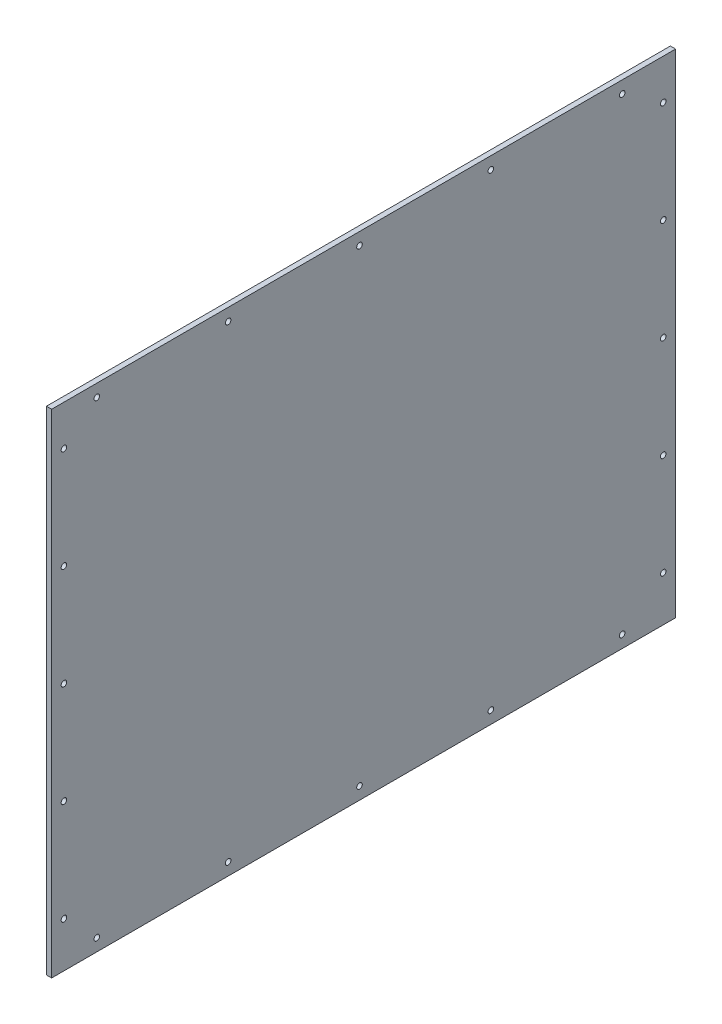
ISO-10303-21;
HEADER;
FILE_DESCRIPTION(('STEP AP214'),'2;1');
FILE_NAME('part.step','',(''),(''),'','','');
FILE_SCHEMA(('AUTOMOTIVE_DESIGN { 1 0 10303 214 1 1 1 1 }'));
ENDSEC;
DATA;
#1=APPLICATION_CONTEXT('core data for automotive mechanical design processes');
#2=APPLICATION_PROTOCOL_DEFINITION('international standard','automotive_design',2000,#1);
#3=PRODUCT_CONTEXT('',#1,'mechanical');
#4=PRODUCT('Part','Part','',(#3));
#5=PRODUCT_RELATED_PRODUCT_CATEGORY('part','',(#4));
#6=PRODUCT_DEFINITION_FORMATION('','',#4);
#7=PRODUCT_DEFINITION_CONTEXT('part definition',#1,'design');
#8=PRODUCT_DEFINITION('design','',#6,#7);
#9=PRODUCT_DEFINITION_SHAPE('','',#8);
#10=(LENGTH_UNIT() NAMED_UNIT(*) SI_UNIT(.MILLI.,.METRE.));
#11=(NAMED_UNIT(*) PLANE_ANGLE_UNIT() SI_UNIT($,.RADIAN.));
#12=(NAMED_UNIT(*) SI_UNIT($,.STERADIAN.) SOLID_ANGLE_UNIT());
#13=UNCERTAINTY_MEASURE_WITH_UNIT(LENGTH_MEASURE(1.E-05),#10,'distance_accuracy_value','');
#14=(GEOMETRIC_REPRESENTATION_CONTEXT(3) GLOBAL_UNCERTAINTY_ASSIGNED_CONTEXT((#13)) GLOBAL_UNIT_ASSIGNED_CONTEXT((#10,
#11,#12)) REPRESENTATION_CONTEXT('',''));
#15=CARTESIAN_POINT('',(0.,0.,0.));
#16=DIRECTION('',(0.,0.,1.));
#17=DIRECTION('',(1.,0.,0.));
#18=AXIS2_PLACEMENT_3D('',#15,#16,#17);
#19=CARTESIAN_POINT('',(247.868827342018,163.360031126517,423.699106878546));
#20=DIRECTION('',(0.,0.,-1.));
#21=DIRECTION('',(0.,1.,0.));
#22=AXIS2_PLACEMENT_3D('',#19,#20,#21);
#23=PLANE('',#22);
#24=DIRECTION('',(0.,-1.,0.));
#25=VECTOR('',#24,1.);
#26=CARTESIAN_POINT('',(244.693827342018,163.360031126517,423.699106878546));
#27=LINE('',#26,#25);
#28=CARTESIAN_POINT('',(244.693827342018,163.360031126517,423.699106878546));
#29=VERTEX_POINT('',#28);
#30=CARTESIAN_POINT('',(244.693827342018,-136.639968873483,423.699106878546));
#31=VERTEX_POINT('',#30);
#32=EDGE_CURVE('E96',#29,#31,#27,.T.);
#33=ORIENTED_EDGE('',*,*,#32,.T.);
#34=DIRECTION('',(-1.,0.,0.));
#35=VECTOR('',#34,1.);
#36=CARTESIAN_POINT('',(247.868827342018,-136.639968873483,423.699106878546));
#37=LINE('',#36,#35);
#38=CARTESIAN_POINT('',(247.868827342018,-136.639968873483,423.699106878546));
#39=VERTEX_POINT('',#38);
#40=EDGE_CURVE('E11',#39,#31,#37,.T.);
#41=ORIENTED_EDGE('',*,*,#40,.F.);
#42=DIRECTION('',(0.,-1.,0.));
#43=VECTOR('',#42,1.);
#44=CARTESIAN_POINT('',(247.868827342018,163.360031126517,423.699106878546));
#45=LINE('',#44,#43);
#46=CARTESIAN_POINT('',(247.868827342018,163.360031126517,423.699106878546));
#47=VERTEX_POINT('',#46);
#48=EDGE_CURVE('E84',#47,#39,#45,.T.);
#49=ORIENTED_EDGE('',*,*,#48,.F.);
#50=DIRECTION('',(-1.,0.,0.));
#51=VECTOR('',#50,1.);
#52=CARTESIAN_POINT('',(247.868827342018,163.360031126517,423.699106878546));
#53=LINE('',#52,#51);
#54=EDGE_CURVE('E92',#47,#29,#53,.T.);
#55=ORIENTED_EDGE('',*,*,#54,.T.);
#56=EDGE_LOOP('',(#33,#41,#49,#55));
#57=FACE_BOUND('',#56,.T.);
#58=ADVANCED_FACE('F33',(#57),#23,.F.);
#59=CARTESIAN_POINT('',(247.868827342018,-136.639968873483,423.699106878546));
#60=DIRECTION('',(0.,1.,0.));
#61=DIRECTION('',(0.,0.,1.));
#62=AXIS2_PLACEMENT_3D('',#59,#60,#61);
#63=PLANE('',#62);
#64=DIRECTION('',(0.,0.,-1.));
#65=VECTOR('',#64,1.);
#66=CARTESIAN_POINT('',(244.693827342018,-136.639968873483,423.699106878546));
#67=LINE('',#66,#65);
#68=CARTESIAN_POINT('',(244.693827342018,-136.639968873483,43.699106878546));
#69=VERTEX_POINT('',#68);
#70=EDGE_CURVE('E88',#31,#69,#67,.T.);
#71=ORIENTED_EDGE('',*,*,#70,.T.);
#72=DIRECTION('',(-1.,0.,0.));
#73=VECTOR('',#72,1.);
#74=CARTESIAN_POINT('',(247.868827342018,-136.639968873483,43.699106878546));
#75=LINE('',#74,#73);
#76=CARTESIAN_POINT('',(247.868827342018,-136.639968873483,43.699106878546));
#77=VERTEX_POINT('',#76);
#78=EDGE_CURVE('E41',#77,#69,#75,.T.);
#79=ORIENTED_EDGE('',*,*,#78,.F.);
#80=DIRECTION('',(0.,0.,-1.));
#81=VECTOR('',#80,1.);
#82=CARTESIAN_POINT('',(247.868827342018,-136.639968873483,423.699106878546));
#83=LINE('',#82,#81);
#84=EDGE_CURVE('E79',#39,#77,#83,.T.);
#85=ORIENTED_EDGE('',*,*,#84,.F.);
#86=ORIENTED_EDGE('',*,*,#40,.T.);
#87=EDGE_LOOP('',(#71,#79,#85,#86));
#88=FACE_BOUND('',#87,.T.);
#89=ADVANCED_FACE('F87',(#88),#63,.F.);
#90=CARTESIAN_POINT('',(247.868827342018,163.360031126517,43.6991068785461));
#91=DIRECTION('',(0.,0.,1.));
#92=DIRECTION('',(0.,-1.,0.));
#93=AXIS2_PLACEMENT_3D('',#90,#91,#92);
#94=PLANE('',#93);
#95=DIRECTION('',(0.,1.,0.));
#96=VECTOR('',#95,1.);
#97=CARTESIAN_POINT('',(244.693827342018,163.360031126517,43.6991068785461));
#98=LINE('',#97,#96);
#99=CARTESIAN_POINT('',(244.693827342018,163.360031126517,43.6991068785461));
#100=VERTEX_POINT('',#99);
#101=EDGE_CURVE('E66',#69,#100,#98,.T.);
#102=ORIENTED_EDGE('',*,*,#101,.T.);
#103=DIRECTION('',(-1.,0.,0.));
#104=VECTOR('',#103,1.);
#105=CARTESIAN_POINT('',(247.868827342018,163.360031126517,43.6991068785461));
#106=LINE('',#105,#104);
#107=CARTESIAN_POINT('',(247.868827342018,163.360031126517,43.6991068785461));
#108=VERTEX_POINT('',#107);
#109=EDGE_CURVE('E89',#108,#100,#106,.T.);
#110=ORIENTED_EDGE('',*,*,#109,.F.);
#111=DIRECTION('',(0.,1.,0.));
#112=VECTOR('',#111,1.);
#113=CARTESIAN_POINT('',(247.868827342018,163.360031126517,43.6991068785461));
#114=LINE('',#113,#112);
#115=EDGE_CURVE('E82',#77,#108,#114,.T.);
#116=ORIENTED_EDGE('',*,*,#115,.F.);
#117=ORIENTED_EDGE('',*,*,#78,.T.);
#118=EDGE_LOOP('',(#102,#110,#116,#117));
#119=FACE_BOUND('',#118,.T.);
#120=ADVANCED_FACE('F90',(#119),#94,.F.);
#121=CARTESIAN_POINT('',(247.868827342018,163.360031126517,423.699106878546));
#122=DIRECTION('',(0.,-1.,0.));
#123=DIRECTION('',(0.,0.,-1.));
#124=AXIS2_PLACEMENT_3D('',#121,#122,#123);
#125=PLANE('',#124);
#126=DIRECTION('',(0.,0.,1.));
#127=VECTOR('',#126,1.);
#128=CARTESIAN_POINT('',(244.693827342018,163.360031126517,423.699106878546));
#129=LINE('',#128,#127);
#130=EDGE_CURVE('E72',#100,#29,#129,.T.);
#131=ORIENTED_EDGE('',*,*,#130,.T.);
#132=ORIENTED_EDGE('',*,*,#54,.F.);
#133=DIRECTION('',(0.,0.,1.));
#134=VECTOR('',#133,1.);
#135=CARTESIAN_POINT('',(247.868827342018,163.360031126517,423.699106878546));
#136=LINE('',#135,#134);
#137=EDGE_CURVE('E49',#108,#47,#136,.T.);
#138=ORIENTED_EDGE('',*,*,#137,.F.);
#139=ORIENTED_EDGE('',*,*,#109,.T.);
#140=EDGE_LOOP('',(#131,#132,#138,#139));
#141=FACE_BOUND('',#140,.T.);
#142=ADVANCED_FACE('F104',(#141),#125,.F.);
#143=CARTESIAN_POINT('',(247.868827342018,0.,0.));
#144=DIRECTION('',(1.,0.,0.));
#145=DIRECTION('',(0.,0.,-1.));
#146=AXIS2_PLACEMENT_3D('',#143,#144,#145);
#147=PLANE('',#146);
#148=CARTESIAN_POINT('',(247.868827342018,-47.1399688734834,416.199106878546));
#149=DIRECTION('',(1.,0.,0.));
#150=DIRECTION('',(0.,0.,-1.));
#151=AXIS2_PLACEMENT_3D('',#148,#149,#150);
#152=CIRCLE('',#151,1.69999999999996);
#153=CARTESIAN_POINT('',(247.868827342018,-47.1399688734834,414.499106878546));
#154=VERTEX_POINT('',#153);
#155=EDGE_CURVE('E180',#154,#154,#152,.T.);
#156=ORIENTED_EDGE('',*,*,#155,.F.);
#157=EDGE_LOOP('',(#156));
#158=FACE_BOUND('',#157,.T.);
#159=CARTESIAN_POINT('',(247.868827342018,-109.139968873483,51.1991068785461));
#160=DIRECTION('',(1.,0.,0.));
#161=DIRECTION('',(0.,0.,-1.));
#162=AXIS2_PLACEMENT_3D('',#159,#160,#161);
#163=CIRCLE('',#162,1.7);
#164=CARTESIAN_POINT('',(247.868827342018,-109.139968873483,49.4991068785461));
#165=VERTEX_POINT('',#164);
#166=EDGE_CURVE('E179',#165,#165,#163,.T.);
#167=ORIENTED_EDGE('',*,*,#166,.F.);
#168=EDGE_LOOP('',(#167));
#169=FACE_BOUND('',#168,.T.);
#170=CARTESIAN_POINT('',(247.868827342018,-129.139968873483,76.1991068785459));
#171=DIRECTION('',(1.,0.,0.));
#172=DIRECTION('',(0.,0.,-1.));
#173=AXIS2_PLACEMENT_3D('',#170,#171,#172);
#174=CIRCLE('',#173,1.70000000000001);
#175=CARTESIAN_POINT('',(247.868827342018,-129.139968873483,74.4991068785459));
#176=VERTEX_POINT('',#175);
#177=EDGE_CURVE('E168',#176,#176,#174,.T.);
#178=ORIENTED_EDGE('',*,*,#177,.F.);
#179=EDGE_LOOP('',(#178));
#180=FACE_BOUND('',#179,.T.);
#181=CARTESIAN_POINT('',(247.868827342018,155.860031126515,76.199106878546));
#182=DIRECTION('',(1.,0.,0.));
#183=DIRECTION('',(0.,0.,-1.));
#184=AXIS2_PLACEMENT_3D('',#181,#182,#183);
#185=CIRCLE('',#184,1.70000000000001);
#186=CARTESIAN_POINT('',(247.868827342018,155.860031126515,74.499106878546));
#187=VERTEX_POINT('',#186);
#188=EDGE_CURVE('E167',#187,#187,#185,.T.);
#189=ORIENTED_EDGE('',*,*,#188,.F.);
#190=EDGE_LOOP('',(#189));
#191=FACE_BOUND('',#190,.T.);
#192=CARTESIAN_POINT('',(247.868827342018,76.8600311265166,416.199106878547));
#193=DIRECTION('',(1.,0.,0.));
#194=DIRECTION('',(0.,0.,-1.));
#195=AXIS2_PLACEMENT_3D('',#192,#193,#194);
#196=CIRCLE('',#195,1.69999999999996);
#197=CARTESIAN_POINT('',(247.868827342018,76.8600311265166,414.499106878547));
#198=VERTEX_POINT('',#197);
#199=EDGE_CURVE('E204',#198,#198,#196,.T.);
#200=ORIENTED_EDGE('',*,*,#199,.F.);
#201=EDGE_LOOP('',(#200));
#202=FACE_BOUND('',#201,.T.);
#203=CARTESIAN_POINT('',(247.868827342018,14.8600311265166,51.1991068785465));
#204=DIRECTION('',(1.,0.,0.));
#205=DIRECTION('',(0.,0.,-1.));
#206=AXIS2_PLACEMENT_3D('',#203,#204,#205);
#207=CIRCLE('',#206,1.7);
#208=CARTESIAN_POINT('',(247.868827342018,14.8600311265166,49.4991068785465));
#209=VERTEX_POINT('',#208);
#210=EDGE_CURVE('E203',#209,#209,#207,.T.);
#211=ORIENTED_EDGE('',*,*,#210,.F.);
#212=EDGE_LOOP('',(#211));
#213=FACE_BOUND('',#212,.T.);
#214=CARTESIAN_POINT('',(247.868827342018,14.8600311265166,416.199106878546));
#215=DIRECTION('',(1.,0.,0.));
#216=DIRECTION('',(0.,0.,-1.));
#217=AXIS2_PLACEMENT_3D('',#214,#215,#216);
#218=CIRCLE('',#217,1.69999999999996);
#219=CARTESIAN_POINT('',(247.868827342018,14.8600311265166,414.499106878546));
#220=VERTEX_POINT('',#219);
#221=EDGE_CURVE('E192',#220,#220,#218,.T.);
#222=ORIENTED_EDGE('',*,*,#221,.F.);
#223=EDGE_LOOP('',(#222));
#224=FACE_BOUND('',#223,.T.);
#225=CARTESIAN_POINT('',(247.868827342018,-47.1399688734834,51.1991068785463));
#226=DIRECTION('',(1.,0.,0.));
#227=DIRECTION('',(0.,0.,-1.));
#228=AXIS2_PLACEMENT_3D('',#225,#226,#227);
#229=CIRCLE('',#228,1.7);
#230=CARTESIAN_POINT('',(247.868827342018,-47.1399688734834,49.4991068785463));
#231=VERTEX_POINT('',#230);
#232=EDGE_CURVE('E191',#231,#231,#229,.T.);
#233=ORIENTED_EDGE('',*,*,#232,.F.);
#234=EDGE_LOOP('',(#233));
#235=FACE_BOUND('',#234,.T.);
#236=CARTESIAN_POINT('',(247.868827342018,-129.139968873483,156.199106878546));
#237=DIRECTION('',(1.,0.,0.));
#238=DIRECTION('',(0.,0.,-1.));
#239=AXIS2_PLACEMENT_3D('',#236,#237,#238);
#240=CIRCLE('',#239,1.70000000000001);
#241=CARTESIAN_POINT('',(247.868827342018,-129.139968873483,154.499106878546));
#242=VERTEX_POINT('',#241);
#243=EDGE_CURVE('E120',#242,#242,#240,.T.);
#244=ORIENTED_EDGE('',*,*,#243,.F.);
#245=EDGE_LOOP('',(#244));
#246=FACE_BOUND('',#245,.T.);
#247=CARTESIAN_POINT('',(247.868827342018,155.860031126515,156.199106878546));
#248=DIRECTION('',(1.,0.,0.));
#249=DIRECTION('',(0.,0.,-1.));
#250=AXIS2_PLACEMENT_3D('',#247,#248,#249);
#251=CIRCLE('',#250,1.70000000000001);
#252=CARTESIAN_POINT('',(247.868827342018,155.860031126515,154.499106878546));
#253=VERTEX_POINT('',#252);
#254=EDGE_CURVE('E119',#253,#253,#251,.T.);
#255=ORIENTED_EDGE('',*,*,#254,.F.);
#256=EDGE_LOOP('',(#255));
#257=FACE_BOUND('',#256,.T.);
#258=CARTESIAN_POINT('',(247.868827342018,-129.139968873483,236.199106878546));
#259=DIRECTION('',(1.,0.,0.));
#260=DIRECTION('',(0.,0.,-1.));
#261=AXIS2_PLACEMENT_3D('',#258,#259,#260);
#262=CIRCLE('',#261,1.70000000000001);
#263=CARTESIAN_POINT('',(247.868827342018,-129.139968873483,234.499106878546));
#264=VERTEX_POINT('',#263);
#265=EDGE_CURVE('E127',#264,#264,#262,.T.);
#266=ORIENTED_EDGE('',*,*,#265,.F.);
#267=EDGE_LOOP('',(#266));
#268=FACE_BOUND('',#267,.T.);
#269=CARTESIAN_POINT('',(247.868827342018,155.860031126515,236.199106878546));
#270=DIRECTION('',(1.,0.,0.));
#271=DIRECTION('',(0.,0.,-1.));
#272=AXIS2_PLACEMENT_3D('',#269,#270,#271);
#273=CIRCLE('',#272,1.70000000000001);
#274=CARTESIAN_POINT('',(247.868827342018,155.860031126515,234.499106878546));
#275=VERTEX_POINT('',#274);
#276=EDGE_CURVE('E133',#275,#275,#273,.T.);
#277=ORIENTED_EDGE('',*,*,#276,.F.);
#278=EDGE_LOOP('',(#277));
#279=FACE_BOUND('',#278,.T.);
#280=CARTESIAN_POINT('',(247.868827342018,-129.139968873483,316.199106878546));
#281=DIRECTION('',(1.,0.,0.));
#282=DIRECTION('',(0.,0.,-1.));
#283=AXIS2_PLACEMENT_3D('',#280,#281,#282);
#284=CIRCLE('',#283,1.69999999999996);
#285=CARTESIAN_POINT('',(247.868827342018,-129.139968873483,314.499106878546));
#286=VERTEX_POINT('',#285);
#287=EDGE_CURVE('E139',#286,#286,#284,.T.);
#288=ORIENTED_EDGE('',*,*,#287,.F.);
#289=EDGE_LOOP('',(#288));
#290=FACE_BOUND('',#289,.T.);
#291=CARTESIAN_POINT('',(247.868827342018,155.860031126515,316.199106878546));
#292=DIRECTION('',(1.,0.,0.));
#293=DIRECTION('',(0.,0.,-1.));
#294=AXIS2_PLACEMENT_3D('',#291,#292,#293);
#295=CIRCLE('',#294,1.69999999999996);
#296=CARTESIAN_POINT('',(247.868827342018,155.860031126515,314.499106878546));
#297=VERTEX_POINT('',#296);
#298=EDGE_CURVE('E145',#297,#297,#295,.T.);
#299=ORIENTED_EDGE('',*,*,#298,.F.);
#300=EDGE_LOOP('',(#299));
#301=FACE_BOUND('',#300,.T.);
#302=CARTESIAN_POINT('',(247.868827342018,-109.139968873483,416.199106878546));
#303=DIRECTION('',(1.,0.,0.));
#304=DIRECTION('',(0.,0.,-1.));
#305=AXIS2_PLACEMENT_3D('',#302,#303,#304);
#306=CIRCLE('',#305,1.70000000000007);
#307=CARTESIAN_POINT('',(247.868827342018,-109.139968873483,414.499106878546));
#308=VERTEX_POINT('',#307);
#309=EDGE_CURVE('E151',#308,#308,#306,.T.);
#310=ORIENTED_EDGE('',*,*,#309,.F.);
#311=EDGE_LOOP('',(#310));
#312=FACE_BOUND('',#311,.T.);
#313=CARTESIAN_POINT('',(247.868827342018,-129.139968873483,396.199106878546));
#314=DIRECTION('',(1.,0.,0.));
#315=DIRECTION('',(0.,0.,-1.));
#316=AXIS2_PLACEMENT_3D('',#313,#314,#315);
#317=CIRCLE('',#316,1.69999999999996);
#318=CARTESIAN_POINT('',(247.868827342018,-129.139968873483,394.499106878546));
#319=VERTEX_POINT('',#318);
#320=EDGE_CURVE('E157',#319,#319,#317,.T.);
#321=ORIENTED_EDGE('',*,*,#320,.F.);
#322=EDGE_LOOP('',(#321));
#323=FACE_BOUND('',#322,.T.);
#324=CARTESIAN_POINT('',(247.868827342018,138.860031126517,51.199106878547));
#325=DIRECTION('',(1.,0.,0.));
#326=DIRECTION('',(0.,0.,-1.));
#327=AXIS2_PLACEMENT_3D('',#324,#325,#326);
#328=CIRCLE('',#327,1.7);
#329=CARTESIAN_POINT('',(247.868827342018,138.860031126517,49.499106878547));
#330=VERTEX_POINT('',#329);
#331=EDGE_CURVE('E226',#330,#330,#328,.T.);
#332=ORIENTED_EDGE('',*,*,#331,.F.);
#333=EDGE_LOOP('',(#332));
#334=FACE_BOUND('',#333,.T.);
#335=CARTESIAN_POINT('',(247.868827342018,138.860031126517,416.199106878547));
#336=DIRECTION('',(1.,0.,0.));
#337=DIRECTION('',(0.,0.,-1.));
#338=AXIS2_PLACEMENT_3D('',#335,#336,#337);
#339=CIRCLE('',#338,1.69999999999996);
#340=CARTESIAN_POINT('',(247.868827342018,138.860031126517,414.499106878547));
#341=VERTEX_POINT('',#340);
#342=EDGE_CURVE('E216',#341,#341,#339,.T.);
#343=ORIENTED_EDGE('',*,*,#342,.F.);
#344=EDGE_LOOP('',(#343));
#345=FACE_BOUND('',#344,.T.);
#346=CARTESIAN_POINT('',(247.868827342018,76.8600311265166,51.1991068785468));
#347=DIRECTION('',(1.,0.,0.));
#348=DIRECTION('',(0.,0.,-1.));
#349=AXIS2_PLACEMENT_3D('',#346,#347,#348);
#350=CIRCLE('',#349,1.7);
#351=CARTESIAN_POINT('',(247.868827342018,76.8600311265166,49.4991068785468));
#352=VERTEX_POINT('',#351);
#353=EDGE_CURVE('E215',#352,#352,#350,.T.);
#354=ORIENTED_EDGE('',*,*,#353,.F.);
#355=EDGE_LOOP('',(#354));
#356=FACE_BOUND('',#355,.T.);
#357=CARTESIAN_POINT('',(247.868827342018,155.860031126515,396.199106878546));
#358=DIRECTION('',(1.,0.,0.));
#359=DIRECTION('',(0.,0.,-1.));
#360=AXIS2_PLACEMENT_3D('',#357,#358,#359);
#361=CIRCLE('',#360,1.69999999999996);
#362=CARTESIAN_POINT('',(247.868827342018,155.860031126515,394.499106878546));
#363=VERTEX_POINT('',#362);
#364=EDGE_CURVE('E112',#363,#363,#361,.T.);
#365=ORIENTED_EDGE('',*,*,#364,.F.);
#366=EDGE_LOOP('',(#365));
#367=FACE_BOUND('',#366,.T.);
#368=ORIENTED_EDGE('',*,*,#48,.T.);
#369=ORIENTED_EDGE('',*,*,#84,.T.);
#370=ORIENTED_EDGE('',*,*,#115,.T.);
#371=ORIENTED_EDGE('',*,*,#137,.T.);
#372=EDGE_LOOP('',(#368,#369,#370,#371));
#373=FACE_BOUND('',#372,.T.);
#374=ADVANCED_FACE('F80',(#158,#169,#180,#191,#202,#213,#224,#235,#246,#257,#268,#279,#290,#301,
#312,#323,#334,#345,#356,#367,#373),#147,.T.);
#375=CARTESIAN_POINT('',(244.693827342018,0.,0.));
#376=DIRECTION('',(1.,0.,0.));
#377=DIRECTION('',(0.,0.,-1.));
#378=AXIS2_PLACEMENT_3D('',#375,#376,#377);
#379=PLANE('',#378);
#380=CARTESIAN_POINT('',(244.693827342018,-47.1399688734834,416.199106878546));
#381=DIRECTION('',(1.,0.,0.));
#382=DIRECTION('',(0.,0.,-1.));
#383=AXIS2_PLACEMENT_3D('',#380,#381,#382);
#384=CIRCLE('',#383,1.69999999999996);
#385=CARTESIAN_POINT('',(244.693827342018,-47.1399688734834,414.499106878546));
#386=VERTEX_POINT('',#385);
#387=EDGE_CURVE('E176',#386,#386,#384,.F.);
#388=ORIENTED_EDGE('',*,*,#387,.F.);
#389=EDGE_LOOP('',(#388));
#390=FACE_BOUND('',#389,.T.);
#391=CARTESIAN_POINT('',(244.693827342018,-109.139968873483,51.1991068785461));
#392=DIRECTION('',(1.,0.,0.));
#393=DIRECTION('',(0.,0.,-1.));
#394=AXIS2_PLACEMENT_3D('',#391,#392,#393);
#395=CIRCLE('',#394,1.7);
#396=CARTESIAN_POINT('',(244.693827342018,-109.139968873483,49.4991068785461));
#397=VERTEX_POINT('',#396);
#398=EDGE_CURVE('E171',#397,#397,#395,.F.);
#399=ORIENTED_EDGE('',*,*,#398,.F.);
#400=EDGE_LOOP('',(#399));
#401=FACE_BOUND('',#400,.T.);
#402=CARTESIAN_POINT('',(244.693827342018,-129.139968873483,76.1991068785459));
#403=DIRECTION('',(1.,0.,0.));
#404=DIRECTION('',(0.,0.,-1.));
#405=AXIS2_PLACEMENT_3D('',#402,#403,#404);
#406=CIRCLE('',#405,1.70000000000001);
#407=CARTESIAN_POINT('',(244.693827342018,-129.139968873483,74.4991068785459));
#408=VERTEX_POINT('',#407);
#409=EDGE_CURVE('E164',#408,#408,#406,.F.);
#410=ORIENTED_EDGE('',*,*,#409,.F.);
#411=EDGE_LOOP('',(#410));
#412=FACE_BOUND('',#411,.T.);
#413=CARTESIAN_POINT('',(244.693827342018,155.860031126515,76.199106878546));
#414=DIRECTION('',(1.,0.,0.));
#415=DIRECTION('',(0.,0.,-1.));
#416=AXIS2_PLACEMENT_3D('',#413,#414,#415);
#417=CIRCLE('',#416,1.70000000000001);
#418=CARTESIAN_POINT('',(244.693827342018,155.860031126515,74.499106878546));
#419=VERTEX_POINT('',#418);
#420=EDGE_CURVE('E123',#419,#419,#417,.F.);
#421=ORIENTED_EDGE('',*,*,#420,.F.);
#422=EDGE_LOOP('',(#421));
#423=FACE_BOUND('',#422,.T.);
#424=CARTESIAN_POINT('',(244.693827342018,76.8600311265166,416.199106878547));
#425=DIRECTION('',(1.,0.,0.));
#426=DIRECTION('',(0.,0.,-1.));
#427=AXIS2_PLACEMENT_3D('',#424,#425,#426);
#428=CIRCLE('',#427,1.69999999999996);
#429=CARTESIAN_POINT('',(244.693827342018,76.8600311265166,414.499106878547));
#430=VERTEX_POINT('',#429);
#431=EDGE_CURVE('E200',#430,#430,#428,.F.);
#432=ORIENTED_EDGE('',*,*,#431,.F.);
#433=EDGE_LOOP('',(#432));
#434=FACE_BOUND('',#433,.T.);
#435=CARTESIAN_POINT('',(244.693827342018,14.8600311265166,51.1991068785465));
#436=DIRECTION('',(1.,0.,0.));
#437=DIRECTION('',(0.,0.,-1.));
#438=AXIS2_PLACEMENT_3D('',#435,#436,#437);
#439=CIRCLE('',#438,1.7);
#440=CARTESIAN_POINT('',(244.693827342018,14.8600311265166,49.4991068785465));
#441=VERTEX_POINT('',#440);
#442=EDGE_CURVE('E195',#441,#441,#439,.F.);
#443=ORIENTED_EDGE('',*,*,#442,.F.);
#444=EDGE_LOOP('',(#443));
#445=FACE_BOUND('',#444,.T.);
#446=CARTESIAN_POINT('',(244.693827342018,14.8600311265166,416.199106878546));
#447=DIRECTION('',(1.,0.,0.));
#448=DIRECTION('',(0.,0.,-1.));
#449=AXIS2_PLACEMENT_3D('',#446,#447,#448);
#450=CIRCLE('',#449,1.69999999999996);
#451=CARTESIAN_POINT('',(244.693827342018,14.8600311265166,414.499106878546));
#452=VERTEX_POINT('',#451);
#453=EDGE_CURVE('E188',#452,#452,#450,.F.);
#454=ORIENTED_EDGE('',*,*,#453,.F.);
#455=EDGE_LOOP('',(#454));
#456=FACE_BOUND('',#455,.T.);
#457=CARTESIAN_POINT('',(244.693827342018,-47.1399688734834,51.1991068785463));
#458=DIRECTION('',(1.,0.,0.));
#459=DIRECTION('',(0.,0.,-1.));
#460=AXIS2_PLACEMENT_3D('',#457,#458,#459);
#461=CIRCLE('',#460,1.7);
#462=CARTESIAN_POINT('',(244.693827342018,-47.1399688734834,49.4991068785463));
#463=VERTEX_POINT('',#462);
#464=EDGE_CURVE('E183',#463,#463,#461,.F.);
#465=ORIENTED_EDGE('',*,*,#464,.F.);
#466=EDGE_LOOP('',(#465));
#467=FACE_BOUND('',#466,.T.);
#468=CARTESIAN_POINT('',(244.693827342018,-129.139968873483,156.199106878546));
#469=DIRECTION('',(1.,0.,0.));
#470=DIRECTION('',(0.,0.,-1.));
#471=AXIS2_PLACEMENT_3D('',#468,#469,#470);
#472=CIRCLE('',#471,1.70000000000001);
#473=CARTESIAN_POINT('',(244.693827342018,-129.139968873483,154.499106878546));
#474=VERTEX_POINT('',#473);
#475=EDGE_CURVE('E116',#474,#474,#472,.F.);
#476=ORIENTED_EDGE('',*,*,#475,.F.);
#477=EDGE_LOOP('',(#476));
#478=FACE_BOUND('',#477,.T.);
#479=CARTESIAN_POINT('',(244.693827342018,155.860031126515,156.199106878546));
#480=DIRECTION('',(1.,0.,0.));
#481=DIRECTION('',(0.,0.,-1.));
#482=AXIS2_PLACEMENT_3D('',#479,#480,#481);
#483=CIRCLE('',#482,1.70000000000001);
#484=CARTESIAN_POINT('',(244.693827342018,155.860031126515,154.499106878546));
#485=VERTEX_POINT('',#484);
#486=EDGE_CURVE('E124',#485,#485,#483,.F.);
#487=ORIENTED_EDGE('',*,*,#486,.F.);
#488=EDGE_LOOP('',(#487));
#489=FACE_BOUND('',#488,.T.);
#490=CARTESIAN_POINT('',(244.693827342018,-129.139968873483,236.199106878546));
#491=DIRECTION('',(1.,0.,0.));
#492=DIRECTION('',(0.,0.,-1.));
#493=AXIS2_PLACEMENT_3D('',#490,#491,#492);
#494=CIRCLE('',#493,1.70000000000001);
#495=CARTESIAN_POINT('',(244.693827342018,-129.139968873483,234.499106878546));
#496=VERTEX_POINT('',#495);
#497=EDGE_CURVE('E130',#496,#496,#494,.F.);
#498=ORIENTED_EDGE('',*,*,#497,.F.);
#499=EDGE_LOOP('',(#498));
#500=FACE_BOUND('',#499,.T.);
#501=CARTESIAN_POINT('',(244.693827342018,155.860031126515,236.199106878546));
#502=DIRECTION('',(1.,0.,0.));
#503=DIRECTION('',(0.,0.,-1.));
#504=AXIS2_PLACEMENT_3D('',#501,#502,#503);
#505=CIRCLE('',#504,1.70000000000001);
#506=CARTESIAN_POINT('',(244.693827342018,155.860031126515,234.499106878546));
#507=VERTEX_POINT('',#506);
#508=EDGE_CURVE('E136',#507,#507,#505,.F.);
#509=ORIENTED_EDGE('',*,*,#508,.F.);
#510=EDGE_LOOP('',(#509));
#511=FACE_BOUND('',#510,.T.);
#512=CARTESIAN_POINT('',(244.693827342018,-129.139968873483,316.199106878546));
#513=DIRECTION('',(1.,0.,0.));
#514=DIRECTION('',(0.,0.,-1.));
#515=AXIS2_PLACEMENT_3D('',#512,#513,#514);
#516=CIRCLE('',#515,1.69999999999996);
#517=CARTESIAN_POINT('',(244.693827342018,-129.139968873483,314.499106878546));
#518=VERTEX_POINT('',#517);
#519=EDGE_CURVE('E142',#518,#518,#516,.F.);
#520=ORIENTED_EDGE('',*,*,#519,.F.);
#521=EDGE_LOOP('',(#520));
#522=FACE_BOUND('',#521,.T.);
#523=CARTESIAN_POINT('',(244.693827342018,155.860031126515,316.199106878546));
#524=DIRECTION('',(1.,0.,0.));
#525=DIRECTION('',(0.,0.,-1.));
#526=AXIS2_PLACEMENT_3D('',#523,#524,#525);
#527=CIRCLE('',#526,1.69999999999996);
#528=CARTESIAN_POINT('',(244.693827342018,155.860031126515,314.499106878546));
#529=VERTEX_POINT('',#528);
#530=EDGE_CURVE('E148',#529,#529,#527,.F.);
#531=ORIENTED_EDGE('',*,*,#530,.F.);
#532=EDGE_LOOP('',(#531));
#533=FACE_BOUND('',#532,.T.);
#534=CARTESIAN_POINT('',(244.693827342018,-109.139968873483,416.199106878546));
#535=DIRECTION('',(1.,0.,0.));
#536=DIRECTION('',(0.,0.,-1.));
#537=AXIS2_PLACEMENT_3D('',#534,#535,#536);
#538=CIRCLE('',#537,1.70000000000007);
#539=CARTESIAN_POINT('',(244.693827342018,-109.139968873483,414.499106878546));
#540=VERTEX_POINT('',#539);
#541=EDGE_CURVE('E154',#540,#540,#538,.F.);
#542=ORIENTED_EDGE('',*,*,#541,.F.);
#543=EDGE_LOOP('',(#542));
#544=FACE_BOUND('',#543,.T.);
#545=CARTESIAN_POINT('',(244.693827342018,-129.139968873483,396.199106878546));
#546=DIRECTION('',(1.,0.,0.));
#547=DIRECTION('',(0.,0.,-1.));
#548=AXIS2_PLACEMENT_3D('',#545,#546,#547);
#549=CIRCLE('',#548,1.69999999999996);
#550=CARTESIAN_POINT('',(244.693827342018,-129.139968873483,394.499106878546));
#551=VERTEX_POINT('',#550);
#552=EDGE_CURVE('E115',#551,#551,#549,.F.);
#553=ORIENTED_EDGE('',*,*,#552,.F.);
#554=EDGE_LOOP('',(#553));
#555=FACE_BOUND('',#554,.T.);
#556=CARTESIAN_POINT('',(244.693827342018,138.860031126517,51.199106878547));
#557=DIRECTION('',(1.,0.,0.));
#558=DIRECTION('',(0.,0.,-1.));
#559=AXIS2_PLACEMENT_3D('',#556,#557,#558);
#560=CIRCLE('',#559,1.7);
#561=CARTESIAN_POINT('',(244.693827342018,138.860031126517,49.499106878547));
#562=VERTEX_POINT('',#561);
#563=EDGE_CURVE('E219',#562,#562,#560,.F.);
#564=ORIENTED_EDGE('',*,*,#563,.F.);
#565=EDGE_LOOP('',(#564));
#566=FACE_BOUND('',#565,.T.);
#567=CARTESIAN_POINT('',(244.693827342018,138.860031126517,416.199106878547));
#568=DIRECTION('',(1.,0.,0.));
#569=DIRECTION('',(0.,0.,-1.));
#570=AXIS2_PLACEMENT_3D('',#567,#568,#569);
#571=CIRCLE('',#570,1.69999999999996);
#572=CARTESIAN_POINT('',(244.693827342018,138.860031126517,414.499106878547));
#573=VERTEX_POINT('',#572);
#574=EDGE_CURVE('E212',#573,#573,#571,.F.);
#575=ORIENTED_EDGE('',*,*,#574,.F.);
#576=EDGE_LOOP('',(#575));
#577=FACE_BOUND('',#576,.T.);
#578=CARTESIAN_POINT('',(244.693827342018,76.8600311265166,51.1991068785468));
#579=DIRECTION('',(1.,0.,0.));
#580=DIRECTION('',(0.,0.,-1.));
#581=AXIS2_PLACEMENT_3D('',#578,#579,#580);
#582=CIRCLE('',#581,1.7);
#583=CARTESIAN_POINT('',(244.693827342018,76.8600311265166,49.4991068785468));
#584=VERTEX_POINT('',#583);
#585=EDGE_CURVE('E207',#584,#584,#582,.F.);
#586=ORIENTED_EDGE('',*,*,#585,.F.);
#587=EDGE_LOOP('',(#586));
#588=FACE_BOUND('',#587,.T.);
#589=CARTESIAN_POINT('',(244.693827342018,155.860031126515,396.199106878546));
#590=DIRECTION('',(1.,0.,0.));
#591=DIRECTION('',(0.,0.,-1.));
#592=AXIS2_PLACEMENT_3D('',#589,#590,#591);
#593=CIRCLE('',#592,1.69999999999996);
#594=CARTESIAN_POINT('',(244.693827342018,155.860031126515,394.499106878546));
#595=VERTEX_POINT('',#594);
#596=EDGE_CURVE('E99',#595,#595,#593,.F.);
#597=ORIENTED_EDGE('',*,*,#596,.F.);
#598=EDGE_LOOP('',(#597));
#599=FACE_BOUND('',#598,.T.);
#600=ORIENTED_EDGE('',*,*,#32,.F.);
#601=ORIENTED_EDGE('',*,*,#130,.F.);
#602=ORIENTED_EDGE('',*,*,#101,.F.);
#603=ORIENTED_EDGE('',*,*,#70,.F.);
#604=EDGE_LOOP('',(#600,#601,#602,#603));
#605=FACE_BOUND('',#604,.T.);
#606=ADVANCED_FACE('F107',(#390,#401,#412,#423,#434,#445,#456,#467,#478,#489,#500,#511,#522,
#533,#544,#555,#566,#577,#588,#599,#605),#379,.F.);
#607=CARTESIAN_POINT('',(244.692827342018,155.860031126515,396.199106878546));
#608=DIRECTION('',(1.,0.,0.));
#609=DIRECTION('',(0.,0.,-1.));
#610=AXIS2_PLACEMENT_3D('',#607,#608,#609);
#611=CYLINDRICAL_SURFACE('',#610,1.69999999999996);
#612=ORIENTED_EDGE('',*,*,#364,.T.);
#613=EDGE_LOOP('',(#612));
#614=FACE_BOUND('',#613,.T.);
#615=ORIENTED_EDGE('',*,*,#596,.T.);
#616=EDGE_LOOP('',(#615));
#617=FACE_BOUND('',#616,.T.);
#618=ADVANCED_FACE('F243',(#614,#617),#611,.F.);
#619=CARTESIAN_POINT('',(244.692827342018,76.8600311265166,51.1991068785468));
#620=DIRECTION('',(1.,0.,0.));
#621=DIRECTION('',(0.,0.,-1.));
#622=AXIS2_PLACEMENT_3D('',#619,#620,#621);
#623=CYLINDRICAL_SURFACE('',#622,1.7);
#624=ORIENTED_EDGE('',*,*,#353,.T.);
#625=EDGE_LOOP('',(#624));
#626=FACE_BOUND('',#625,.T.);
#627=ORIENTED_EDGE('',*,*,#585,.T.);
#628=EDGE_LOOP('',(#627));
#629=FACE_BOUND('',#628,.T.);
#630=ADVANCED_FACE('F246',(#626,#629),#623,.F.);
#631=CARTESIAN_POINT('',(244.692827342018,138.860031126517,416.199106878547));
#632=DIRECTION('',(1.,0.,0.));
#633=DIRECTION('',(0.,0.,-1.));
#634=AXIS2_PLACEMENT_3D('',#631,#632,#633);
#635=CYLINDRICAL_SURFACE('',#634,1.69999999999996);
#636=ORIENTED_EDGE('',*,*,#342,.T.);
#637=EDGE_LOOP('',(#636));
#638=FACE_BOUND('',#637,.T.);
#639=ORIENTED_EDGE('',*,*,#574,.T.);
#640=EDGE_LOOP('',(#639));
#641=FACE_BOUND('',#640,.T.);
#642=ADVANCED_FACE('F294',(#638,#641),#635,.F.);
#643=CARTESIAN_POINT('',(244.692827342018,138.860031126517,51.199106878547));
#644=DIRECTION('',(1.,0.,0.));
#645=DIRECTION('',(0.,0.,-1.));
#646=AXIS2_PLACEMENT_3D('',#643,#644,#645);
#647=CYLINDRICAL_SURFACE('',#646,1.7);
#648=ORIENTED_EDGE('',*,*,#331,.T.);
#649=EDGE_LOOP('',(#648));
#650=FACE_BOUND('',#649,.T.);
#651=ORIENTED_EDGE('',*,*,#563,.T.);
#652=EDGE_LOOP('',(#651));
#653=FACE_BOUND('',#652,.T.);
#654=ADVANCED_FACE('F230',(#650,#653),#647,.F.);
#655=CARTESIAN_POINT('',(244.692827342018,-129.139968873483,396.199106878546));
#656=DIRECTION('',(1.,0.,0.));
#657=DIRECTION('',(0.,0.,-1.));
#658=AXIS2_PLACEMENT_3D('',#655,#656,#657);
#659=CYLINDRICAL_SURFACE('',#658,1.69999999999996);
#660=ORIENTED_EDGE('',*,*,#320,.T.);
#661=EDGE_LOOP('',(#660));
#662=FACE_BOUND('',#661,.T.);
#663=ORIENTED_EDGE('',*,*,#552,.T.);
#664=EDGE_LOOP('',(#663));
#665=FACE_BOUND('',#664,.T.);
#666=ADVANCED_FACE('F313',(#662,#665),#659,.F.);
#667=CARTESIAN_POINT('',(244.692827342018,-109.139968873483,416.199106878546));
#668=DIRECTION('',(1.,0.,0.));
#669=DIRECTION('',(0.,0.,-1.));
#670=AXIS2_PLACEMENT_3D('',#667,#668,#669);
#671=CYLINDRICAL_SURFACE('',#670,1.70000000000007);
#672=ORIENTED_EDGE('',*,*,#309,.T.);
#673=EDGE_LOOP('',(#672));
#674=FACE_BOUND('',#673,.T.);
#675=ORIENTED_EDGE('',*,*,#541,.T.);
#676=EDGE_LOOP('',(#675));
#677=FACE_BOUND('',#676,.T.);
#678=ADVANCED_FACE('F322',(#674,#677),#671,.F.);
#679=CARTESIAN_POINT('',(244.692827342018,155.860031126515,316.199106878546));
#680=DIRECTION('',(1.,0.,0.));
#681=DIRECTION('',(0.,0.,-1.));
#682=AXIS2_PLACEMENT_3D('',#679,#680,#681);
#683=CYLINDRICAL_SURFACE('',#682,1.69999999999996);
#684=ORIENTED_EDGE('',*,*,#298,.T.);
#685=EDGE_LOOP('',(#684));
#686=FACE_BOUND('',#685,.T.);
#687=ORIENTED_EDGE('',*,*,#530,.T.);
#688=EDGE_LOOP('',(#687));
#689=FACE_BOUND('',#688,.T.);
#690=ADVANCED_FACE('F332',(#686,#689),#683,.F.);
#691=CARTESIAN_POINT('',(244.692827342018,-129.139968873483,316.199106878546));
#692=DIRECTION('',(1.,0.,0.));
#693=DIRECTION('',(0.,0.,-1.));
#694=AXIS2_PLACEMENT_3D('',#691,#692,#693);
#695=CYLINDRICAL_SURFACE('',#694,1.69999999999996);
#696=ORIENTED_EDGE('',*,*,#287,.T.);
#697=EDGE_LOOP('',(#696));
#698=FACE_BOUND('',#697,.T.);
#699=ORIENTED_EDGE('',*,*,#519,.T.);
#700=EDGE_LOOP('',(#699));
#701=FACE_BOUND('',#700,.T.);
#702=ADVANCED_FACE('F342',(#698,#701),#695,.F.);
#703=CARTESIAN_POINT('',(244.692827342018,155.860031126515,236.199106878546));
#704=DIRECTION('',(1.,0.,0.));
#705=DIRECTION('',(0.,0.,-1.));
#706=AXIS2_PLACEMENT_3D('',#703,#704,#705);
#707=CYLINDRICAL_SURFACE('',#706,1.70000000000001);
#708=ORIENTED_EDGE('',*,*,#276,.T.);
#709=EDGE_LOOP('',(#708));
#710=FACE_BOUND('',#709,.T.);
#711=ORIENTED_EDGE('',*,*,#508,.T.);
#712=EDGE_LOOP('',(#711));
#713=FACE_BOUND('',#712,.T.);
#714=ADVANCED_FACE('F352',(#710,#713),#707,.F.);
#715=CARTESIAN_POINT('',(244.692827342018,-129.139968873483,236.199106878546));
#716=DIRECTION('',(1.,0.,0.));
#717=DIRECTION('',(0.,0.,-1.));
#718=AXIS2_PLACEMENT_3D('',#715,#716,#717);
#719=CYLINDRICAL_SURFACE('',#718,1.70000000000001);
#720=ORIENTED_EDGE('',*,*,#265,.T.);
#721=EDGE_LOOP('',(#720));
#722=FACE_BOUND('',#721,.T.);
#723=ORIENTED_EDGE('',*,*,#497,.T.);
#724=EDGE_LOOP('',(#723));
#725=FACE_BOUND('',#724,.T.);
#726=ADVANCED_FACE('F362',(#722,#725),#719,.F.);
#727=CARTESIAN_POINT('',(244.692827342018,155.860031126515,156.199106878546));
#728=DIRECTION('',(1.,0.,0.));
#729=DIRECTION('',(0.,0.,-1.));
#730=AXIS2_PLACEMENT_3D('',#727,#728,#729);
#731=CYLINDRICAL_SURFACE('',#730,1.70000000000001);
#732=ORIENTED_EDGE('',*,*,#254,.T.);
#733=EDGE_LOOP('',(#732));
#734=FACE_BOUND('',#733,.T.);
#735=ORIENTED_EDGE('',*,*,#486,.T.);
#736=EDGE_LOOP('',(#735));
#737=FACE_BOUND('',#736,.T.);
#738=ADVANCED_FACE('F372',(#734,#737),#731,.F.);
#739=CARTESIAN_POINT('',(244.692827342018,-129.139968873483,156.199106878546));
#740=DIRECTION('',(1.,0.,0.));
#741=DIRECTION('',(0.,0.,-1.));
#742=AXIS2_PLACEMENT_3D('',#739,#740,#741);
#743=CYLINDRICAL_SURFACE('',#742,1.70000000000001);
#744=ORIENTED_EDGE('',*,*,#243,.T.);
#745=EDGE_LOOP('',(#744));
#746=FACE_BOUND('',#745,.T.);
#747=ORIENTED_EDGE('',*,*,#475,.T.);
#748=EDGE_LOOP('',(#747));
#749=FACE_BOUND('',#748,.T.);
#750=ADVANCED_FACE('F382',(#746,#749),#743,.F.);
#751=CARTESIAN_POINT('',(244.692827342018,-47.1399688734834,51.1991068785463));
#752=DIRECTION('',(1.,0.,0.));
#753=DIRECTION('',(0.,0.,-1.));
#754=AXIS2_PLACEMENT_3D('',#751,#752,#753);
#755=CYLINDRICAL_SURFACE('',#754,1.7);
#756=ORIENTED_EDGE('',*,*,#232,.T.);
#757=EDGE_LOOP('',(#756));
#758=FACE_BOUND('',#757,.T.);
#759=ORIENTED_EDGE('',*,*,#464,.T.);
#760=EDGE_LOOP('',(#759));
#761=FACE_BOUND('',#760,.T.);
#762=ADVANCED_FACE('F392',(#758,#761),#755,.F.);
#763=CARTESIAN_POINT('',(244.692827342018,14.8600311265166,416.199106878546));
#764=DIRECTION('',(1.,0.,0.));
#765=DIRECTION('',(0.,0.,-1.));
#766=AXIS2_PLACEMENT_3D('',#763,#764,#765);
#767=CYLINDRICAL_SURFACE('',#766,1.69999999999996);
#768=ORIENTED_EDGE('',*,*,#221,.T.);
#769=EDGE_LOOP('',(#768));
#770=FACE_BOUND('',#769,.T.);
#771=ORIENTED_EDGE('',*,*,#453,.T.);
#772=EDGE_LOOP('',(#771));
#773=FACE_BOUND('',#772,.T.);
#774=ADVANCED_FACE('F402',(#770,#773),#767,.F.);
#775=CARTESIAN_POINT('',(244.692827342018,14.8600311265166,51.1991068785465));
#776=DIRECTION('',(1.,0.,0.));
#777=DIRECTION('',(0.,0.,-1.));
#778=AXIS2_PLACEMENT_3D('',#775,#776,#777);
#779=CYLINDRICAL_SURFACE('',#778,1.7);
#780=ORIENTED_EDGE('',*,*,#210,.T.);
#781=EDGE_LOOP('',(#780));
#782=FACE_BOUND('',#781,.T.);
#783=ORIENTED_EDGE('',*,*,#442,.T.);
#784=EDGE_LOOP('',(#783));
#785=FACE_BOUND('',#784,.T.);
#786=ADVANCED_FACE('F412',(#782,#785),#779,.F.);
#787=CARTESIAN_POINT('',(244.692827342018,76.8600311265166,416.199106878547));
#788=DIRECTION('',(1.,0.,0.));
#789=DIRECTION('',(0.,0.,-1.));
#790=AXIS2_PLACEMENT_3D('',#787,#788,#789);
#791=CYLINDRICAL_SURFACE('',#790,1.69999999999996);
#792=ORIENTED_EDGE('',*,*,#199,.T.);
#793=EDGE_LOOP('',(#792));
#794=FACE_BOUND('',#793,.T.);
#795=ORIENTED_EDGE('',*,*,#431,.T.);
#796=EDGE_LOOP('',(#795));
#797=FACE_BOUND('',#796,.T.);
#798=ADVANCED_FACE('F422',(#794,#797),#791,.F.);
#799=CARTESIAN_POINT('',(244.692827342018,155.860031126515,76.199106878546));
#800=DIRECTION('',(1.,0.,0.));
#801=DIRECTION('',(0.,0.,-1.));
#802=AXIS2_PLACEMENT_3D('',#799,#800,#801);
#803=CYLINDRICAL_SURFACE('',#802,1.70000000000001);
#804=ORIENTED_EDGE('',*,*,#188,.T.);
#805=EDGE_LOOP('',(#804));
#806=FACE_BOUND('',#805,.T.);
#807=ORIENTED_EDGE('',*,*,#420,.T.);
#808=EDGE_LOOP('',(#807));
#809=FACE_BOUND('',#808,.T.);
#810=ADVANCED_FACE('F432',(#806,#809),#803,.F.);
#811=CARTESIAN_POINT('',(244.692827342018,-129.139968873483,76.1991068785459));
#812=DIRECTION('',(1.,0.,0.));
#813=DIRECTION('',(0.,0.,-1.));
#814=AXIS2_PLACEMENT_3D('',#811,#812,#813);
#815=CYLINDRICAL_SURFACE('',#814,1.70000000000001);
#816=ORIENTED_EDGE('',*,*,#177,.T.);
#817=EDGE_LOOP('',(#816));
#818=FACE_BOUND('',#817,.T.);
#819=ORIENTED_EDGE('',*,*,#409,.T.);
#820=EDGE_LOOP('',(#819));
#821=FACE_BOUND('',#820,.T.);
#822=ADVANCED_FACE('F442',(#818,#821),#815,.F.);
#823=CARTESIAN_POINT('',(244.692827342018,-109.139968873483,51.1991068785461));
#824=DIRECTION('',(1.,0.,0.));
#825=DIRECTION('',(0.,0.,-1.));
#826=AXIS2_PLACEMENT_3D('',#823,#824,#825);
#827=CYLINDRICAL_SURFACE('',#826,1.7);
#828=ORIENTED_EDGE('',*,*,#166,.T.);
#829=EDGE_LOOP('',(#828));
#830=FACE_BOUND('',#829,.T.);
#831=ORIENTED_EDGE('',*,*,#398,.T.);
#832=EDGE_LOOP('',(#831));
#833=FACE_BOUND('',#832,.T.);
#834=ADVANCED_FACE('F452',(#830,#833),#827,.F.);
#835=CARTESIAN_POINT('',(244.692827342018,-47.1399688734834,416.199106878546));
#836=DIRECTION('',(1.,0.,0.));
#837=DIRECTION('',(0.,0.,-1.));
#838=AXIS2_PLACEMENT_3D('',#835,#836,#837);
#839=CYLINDRICAL_SURFACE('',#838,1.69999999999996);
#840=ORIENTED_EDGE('',*,*,#155,.T.);
#841=EDGE_LOOP('',(#840));
#842=FACE_BOUND('',#841,.T.);
#843=ORIENTED_EDGE('',*,*,#387,.T.);
#844=EDGE_LOOP('',(#843));
#845=FACE_BOUND('',#844,.T.);
#846=ADVANCED_FACE('F462',(#842,#845),#839,.F.);
#847=CLOSED_SHELL('',(#58,#89,#120,#142,#374,#606,#618,#630,#642,#654,#666,#678,#690,#702,#714,
#726,#738,#750,#762,#774,#786,#798,#810,#822,#834,#846));
#848=MANIFOLD_SOLID_BREP('B2',#847);
#849=ADVANCED_BREP_SHAPE_REPRESENTATION('',(#18,#848),#14);
#850=SHAPE_DEFINITION_REPRESENTATION(#9,#849);
ENDSEC;
END-ISO-10303-21;
